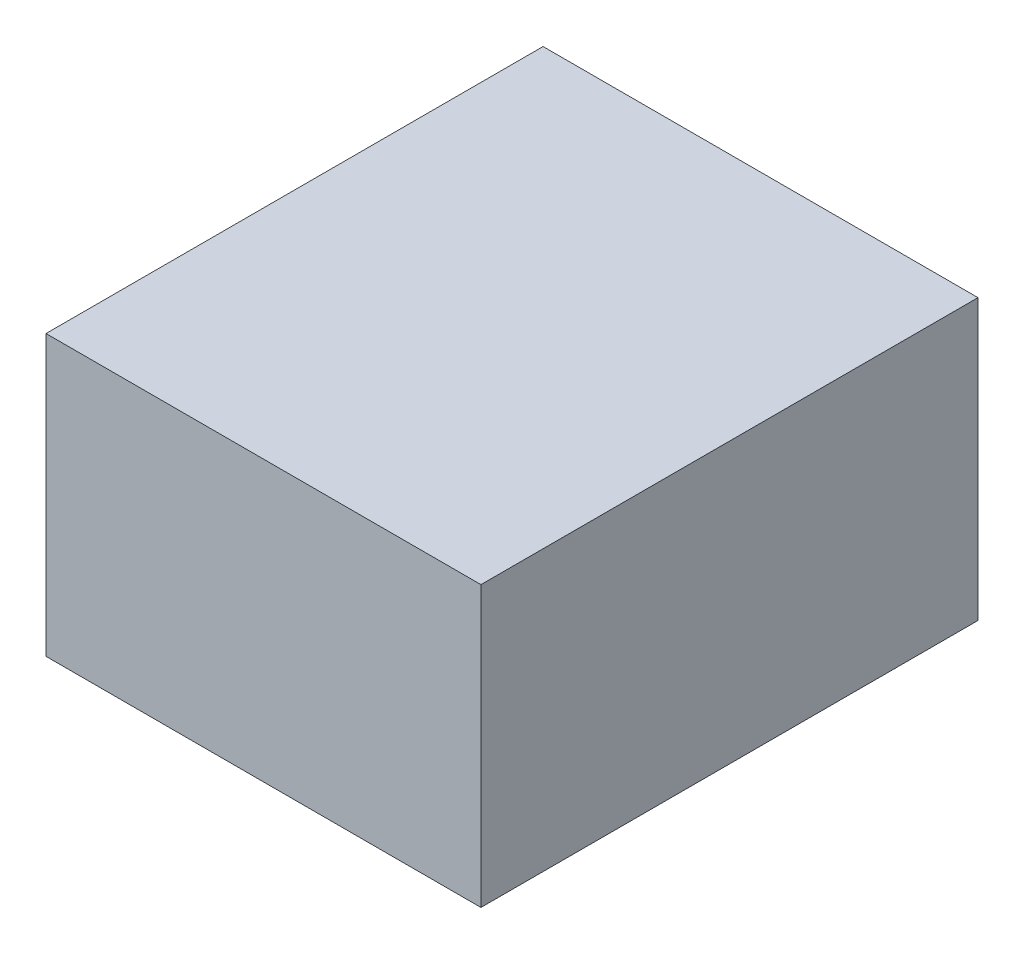
ISO-10303-21;
HEADER;
FILE_DESCRIPTION(('STEP AP214'),'2;1');
FILE_NAME('part.step','',(''),(''),'','','');
FILE_SCHEMA(('AUTOMOTIVE_DESIGN { 1 0 10303 214 1 1 1 1 }'));
ENDSEC;
DATA;
#1=APPLICATION_CONTEXT('core data for automotive mechanical design processes');
#2=APPLICATION_PROTOCOL_DEFINITION('international standard','automotive_design',2000,#1);
#3=PRODUCT_CONTEXT('',#1,'mechanical');
#4=PRODUCT('Part','Part','',(#3));
#5=PRODUCT_RELATED_PRODUCT_CATEGORY('part','',(#4));
#6=PRODUCT_DEFINITION_FORMATION('','',#4);
#7=PRODUCT_DEFINITION_CONTEXT('part definition',#1,'design');
#8=PRODUCT_DEFINITION('design','',#6,#7);
#9=PRODUCT_DEFINITION_SHAPE('','',#8);
#10=(LENGTH_UNIT() NAMED_UNIT(*) SI_UNIT(.MILLI.,.METRE.));
#11=(NAMED_UNIT(*) PLANE_ANGLE_UNIT() SI_UNIT($,.RADIAN.));
#12=(NAMED_UNIT(*) SI_UNIT($,.STERADIAN.) SOLID_ANGLE_UNIT());
#13=UNCERTAINTY_MEASURE_WITH_UNIT(LENGTH_MEASURE(1.E-05),#10,'distance_accuracy_value','');
#14=(GEOMETRIC_REPRESENTATION_CONTEXT(3) GLOBAL_UNCERTAINTY_ASSIGNED_CONTEXT((#13)) GLOBAL_UNIT_ASSIGNED_CONTEXT((#10,
#11,#12)) REPRESENTATION_CONTEXT('',''));
#15=CARTESIAN_POINT('',(0.,0.,0.));
#16=DIRECTION('',(0.,0.,1.));
#17=DIRECTION('',(1.,0.,0.));
#18=AXIS2_PLACEMENT_3D('',#15,#16,#17);
#19=CARTESIAN_POINT('',(-100.,-1875.,400.));
#20=DIRECTION('',(1.,0.,0.));
#21=DIRECTION('',(0.,0.,-1.));
#22=AXIS2_PLACEMENT_3D('',#19,#20,#21);
#23=PLANE('',#22);
#24=DIRECTION('',(0.,-1.,0.));
#25=VECTOR('',#24,1.);
#26=CARTESIAN_POINT('',(-100.,-1875.,-400.));
#27=LINE('',#26,#25);
#28=CARTESIAN_POINT('',(-100.,-1425.,-400.));
#29=VERTEX_POINT('',#28);
#30=CARTESIAN_POINT('',(-100.,-1875.,-400.));
#31=VERTEX_POINT('',#30);
#32=EDGE_CURVE('E105',#29,#31,#27,.T.);
#33=ORIENTED_EDGE('',*,*,#32,.T.);
#34=DIRECTION('',(0.,0.,-1.));
#35=VECTOR('',#34,1.);
#36=CARTESIAN_POINT('',(-100.,-1875.,400.));
#37=LINE('',#36,#35);
#38=CARTESIAN_POINT('',(-100.,-1875.,400.));
#39=VERTEX_POINT('',#38);
#40=EDGE_CURVE('E11',#39,#31,#37,.T.);
#41=ORIENTED_EDGE('',*,*,#40,.F.);
#42=DIRECTION('',(0.,-1.,0.));
#43=VECTOR('',#42,1.);
#44=CARTESIAN_POINT('',(-100.,-1875.,400.));
#45=LINE('',#44,#43);
#46=CARTESIAN_POINT('',(-100.,-1425.,400.));
#47=VERTEX_POINT('',#46);
#48=EDGE_CURVE('E89',#47,#39,#45,.T.);
#49=ORIENTED_EDGE('',*,*,#48,.F.);
#50=DIRECTION('',(0.,0.,-1.));
#51=VECTOR('',#50,1.);
#52=CARTESIAN_POINT('',(-100.,-1425.,400.));
#53=LINE('',#52,#51);
#54=EDGE_CURVE('E98',#47,#29,#53,.T.);
#55=ORIENTED_EDGE('',*,*,#54,.T.);
#56=EDGE_LOOP('',(#33,#41,#49,#55));
#57=FACE_BOUND('',#56,.T.);
#58=ADVANCED_FACE('F39',(#57),#23,.F.);
#59=CARTESIAN_POINT('',(-100.,-1875.,400.));
#60=DIRECTION('',(0.,1.,0.));
#61=DIRECTION('',(0.,0.,1.));
#62=AXIS2_PLACEMENT_3D('',#59,#60,#61);
#63=PLANE('',#62);
#64=DIRECTION('',(1.,0.,0.));
#65=VECTOR('',#64,1.);
#66=CARTESIAN_POINT('',(-100.,-1875.,-400.));
#67=LINE('',#66,#65);
#68=CARTESIAN_POINT('',(600.,-1875.,-400.));
#69=VERTEX_POINT('',#68);
#70=EDGE_CURVE('E94',#31,#69,#67,.T.);
#71=ORIENTED_EDGE('',*,*,#70,.T.);
#72=DIRECTION('',(0.,0.,-1.));
#73=VECTOR('',#72,1.);
#74=CARTESIAN_POINT('',(600.,-1875.,400.));
#75=LINE('',#74,#73);
#76=CARTESIAN_POINT('',(600.,-1875.,400.));
#77=VERTEX_POINT('',#76);
#78=EDGE_CURVE('E50',#77,#69,#75,.T.);
#79=ORIENTED_EDGE('',*,*,#78,.F.);
#80=DIRECTION('',(1.,0.,0.));
#81=VECTOR('',#80,1.);
#82=CARTESIAN_POINT('',(-100.,-1875.,400.));
#83=LINE('',#82,#81);
#84=EDGE_CURVE('E83',#39,#77,#83,.T.);
#85=ORIENTED_EDGE('',*,*,#84,.F.);
#86=ORIENTED_EDGE('',*,*,#40,.T.);
#87=EDGE_LOOP('',(#71,#79,#85,#86));
#88=FACE_BOUND('',#87,.T.);
#89=ADVANCED_FACE('F91',(#88),#63,.F.);
#90=CARTESIAN_POINT('',(600.,-1875.,400.));
#91=DIRECTION('',(-1.,0.,0.));
#92=DIRECTION('',(0.,0.,1.));
#93=AXIS2_PLACEMENT_3D('',#90,#91,#92);
#94=PLANE('',#93);
#95=DIRECTION('',(0.,1.,0.));
#96=VECTOR('',#95,1.);
#97=CARTESIAN_POINT('',(600.,-1875.,-400.));
#98=LINE('',#97,#96);
#99=CARTESIAN_POINT('',(600.,-1425.,-400.));
#100=VERTEX_POINT('',#99);
#101=EDGE_CURVE('E75',#69,#100,#98,.T.);
#102=ORIENTED_EDGE('',*,*,#101,.T.);
#103=DIRECTION('',(0.,0.,-1.));
#104=VECTOR('',#103,1.);
#105=CARTESIAN_POINT('',(600.,-1425.,400.));
#106=LINE('',#105,#104);
#107=CARTESIAN_POINT('',(600.,-1425.,400.));
#108=VERTEX_POINT('',#107);
#109=EDGE_CURVE('E92',#108,#100,#106,.T.);
#110=ORIENTED_EDGE('',*,*,#109,.F.);
#111=DIRECTION('',(0.,1.,0.));
#112=VECTOR('',#111,1.);
#113=CARTESIAN_POINT('',(600.,-1875.,400.));
#114=LINE('',#113,#112);
#115=EDGE_CURVE('E86',#77,#108,#114,.T.);
#116=ORIENTED_EDGE('',*,*,#115,.F.);
#117=ORIENTED_EDGE('',*,*,#78,.T.);
#118=EDGE_LOOP('',(#102,#110,#116,#117));
#119=FACE_BOUND('',#118,.T.);
#120=ADVANCED_FACE('F96',(#119),#94,.F.);
#121=CARTESIAN_POINT('',(-100.,-1425.,400.));
#122=DIRECTION('',(0.,-1.,0.));
#123=DIRECTION('',(0.,0.,-1.));
#124=AXIS2_PLACEMENT_3D('',#121,#122,#123);
#125=PLANE('',#124);
#126=DIRECTION('',(-1.,0.,0.));
#127=VECTOR('',#126,1.);
#128=CARTESIAN_POINT('',(-100.,-1425.,-400.));
#129=LINE('',#128,#127);
#130=EDGE_CURVE('E79',#100,#29,#129,.T.);
#131=ORIENTED_EDGE('',*,*,#130,.T.);
#132=ORIENTED_EDGE('',*,*,#54,.F.);
#133=DIRECTION('',(-1.,0.,0.));
#134=VECTOR('',#133,1.);
#135=CARTESIAN_POINT('',(-100.,-1425.,400.));
#136=LINE('',#135,#134);
#137=EDGE_CURVE('E54',#108,#47,#136,.T.);
#138=ORIENTED_EDGE('',*,*,#137,.F.);
#139=ORIENTED_EDGE('',*,*,#109,.T.);
#140=EDGE_LOOP('',(#131,#132,#138,#139));
#141=FACE_BOUND('',#140,.T.);
#142=ADVANCED_FACE('F108',(#141),#125,.F.);
#143=CARTESIAN_POINT('',(0.,0.,400.));
#144=DIRECTION('',(0.,0.,-1.));
#145=DIRECTION('',(-1.,0.,0.));
#146=AXIS2_PLACEMENT_3D('',#143,#144,#145);
#147=PLANE('',#146);
#148=ORIENTED_EDGE('',*,*,#48,.T.);
#149=ORIENTED_EDGE('',*,*,#84,.T.);
#150=ORIENTED_EDGE('',*,*,#115,.T.);
#151=ORIENTED_EDGE('',*,*,#137,.T.);
#152=EDGE_LOOP('',(#148,#149,#150,#151));
#153=FACE_BOUND('',#152,.T.);
#154=ADVANCED_FACE('F88',(#153),#147,.F.);
#155=CARTESIAN_POINT('',(0.,0.,-400.));
#156=DIRECTION('',(0.,0.,-1.));
#157=DIRECTION('',(-1.,0.,0.));
#158=AXIS2_PLACEMENT_3D('',#155,#156,#157);
#159=PLANE('',#158);
#160=ORIENTED_EDGE('',*,*,#32,.F.);
#161=ORIENTED_EDGE('',*,*,#130,.F.);
#162=ORIENTED_EDGE('',*,*,#101,.F.);
#163=ORIENTED_EDGE('',*,*,#70,.F.);
#164=EDGE_LOOP('',(#160,#161,#162,#163));
#165=FACE_BOUND('',#164,.T.);
#166=ADVANCED_FACE('F115',(#165),#159,.T.);
#167=CLOSED_SHELL('',(#58,#89,#120,#142,#154,#166));
#168=MANIFOLD_SOLID_BREP('B2',#167);
#169=ADVANCED_BREP_SHAPE_REPRESENTATION('',(#18,#168),#14);
#170=SHAPE_DEFINITION_REPRESENTATION(#9,#169);
ENDSEC;
END-ISO-10303-21;
